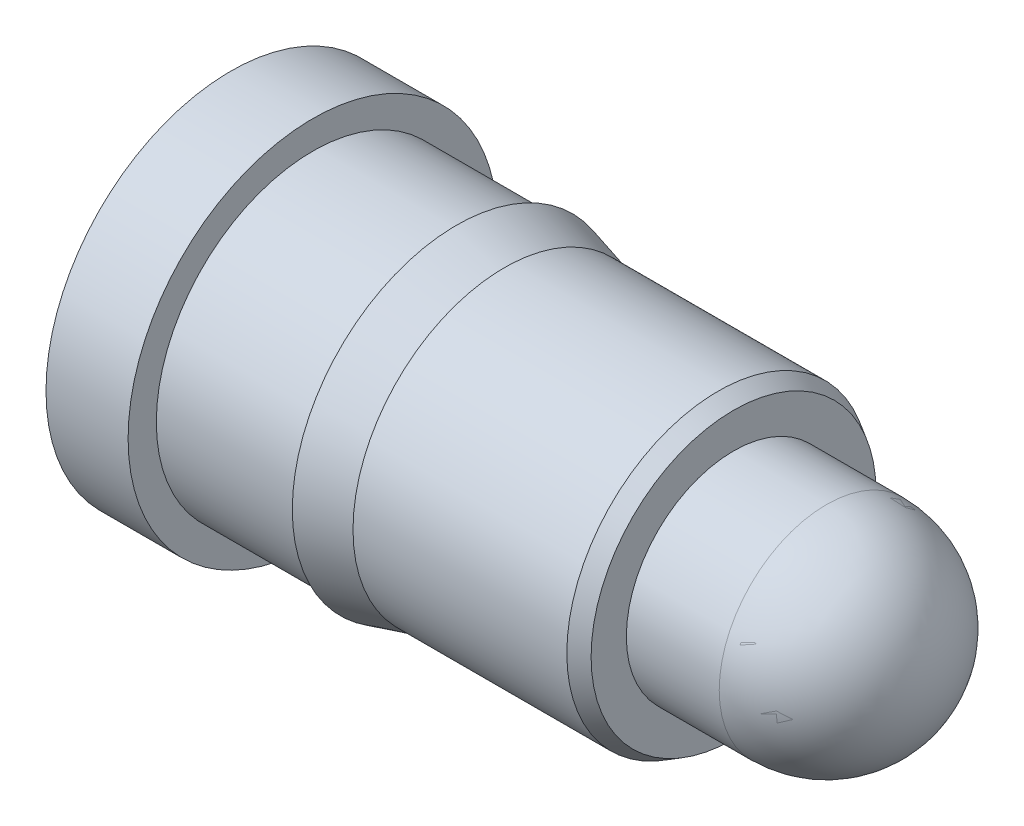
ISO-10303-21;
HEADER;
FILE_DESCRIPTION(('STEP AP214'),'2;1');
FILE_NAME('part.step','',(''),(''),'','','');
FILE_SCHEMA(('AUTOMOTIVE_DESIGN { 1 0 10303 214 1 1 1 1 }'));
ENDSEC;
DATA;
#1=APPLICATION_CONTEXT('core data for automotive mechanical design processes');
#2=APPLICATION_PROTOCOL_DEFINITION('international standard','automotive_design',2000,#1);
#3=PRODUCT_CONTEXT('',#1,'mechanical');
#4=PRODUCT('Part','Part','',(#3));
#5=PRODUCT_RELATED_PRODUCT_CATEGORY('part','',(#4));
#6=PRODUCT_DEFINITION_FORMATION('','',#4);
#7=PRODUCT_DEFINITION_CONTEXT('part definition',#1,'design');
#8=PRODUCT_DEFINITION('design','',#6,#7);
#9=PRODUCT_DEFINITION_SHAPE('','',#8);
#10=(LENGTH_UNIT() NAMED_UNIT(*) SI_UNIT(.MILLI.,.METRE.));
#11=(NAMED_UNIT(*) PLANE_ANGLE_UNIT() SI_UNIT($,.RADIAN.));
#12=(NAMED_UNIT(*) SI_UNIT($,.STERADIAN.) SOLID_ANGLE_UNIT());
#13=UNCERTAINTY_MEASURE_WITH_UNIT(LENGTH_MEASURE(1.E-05),#10,'distance_accuracy_value','');
#14=(GEOMETRIC_REPRESENTATION_CONTEXT(3) GLOBAL_UNCERTAINTY_ASSIGNED_CONTEXT((#13)) GLOBAL_UNIT_ASSIGNED_CONTEXT((#10,
#11,#12)) REPRESENTATION_CONTEXT('',''));
#15=CARTESIAN_POINT('',(0.,0.,0.));
#16=DIRECTION('',(0.,0.,1.));
#17=DIRECTION('',(1.,0.,0.));
#18=AXIS2_PLACEMENT_3D('',#15,#16,#17);
#19=CARTESIAN_POINT('',(2.4892,0.,0.));
#20=DIRECTION('',(-1.,0.,0.));
#21=DIRECTION('',(0.,0.,1.));
#22=AXIS2_PLACEMENT_3D('',#19,#20,#21);
#23=CYLINDRICAL_SURFACE('',#22,0.7493);
#24=CARTESIAN_POINT('',(2.413,0.,0.));
#25=DIRECTION('',(1.,0.,0.));
#26=DIRECTION('',(0.,0.,-1.));
#27=AXIS2_PLACEMENT_3D('',#24,#25,#26);
#28=CIRCLE('',#27,0.7493);
#29=CARTESIAN_POINT('',(2.413,0.,-0.7493));
#30=VERTEX_POINT('',#29);
#31=EDGE_CURVE('P0_E50',#30,#30,#28,.F.);
#32=ORIENTED_EDGE('',*,*,#31,.T.);
#33=EDGE_LOOP('',(#32));
#34=FACE_BOUND('',#33,.T.);
#35=CARTESIAN_POINT('',(1.35458522628063,0.,0.));
#36=DIRECTION('',(-1.,0.,0.));
#37=DIRECTION('',(0.,0.,1.));
#38=AXIS2_PLACEMENT_3D('',#35,#36,#37);
#39=CIRCLE('',#38,0.7493);
#40=CARTESIAN_POINT('',(1.35458522628063,0.,0.7493));
#41=VERTEX_POINT('',#40);
#42=EDGE_CURVE('P0_E75',#41,#41,#39,.T.);
#43=ORIENTED_EDGE('',*,*,#42,.F.);
#44=EDGE_LOOP('',(#43));
#45=FACE_BOUND('',#44,.T.);
#46=ADVANCED_FACE('P0_F42',(#34,#45),#23,.T.);
#47=CARTESIAN_POINT('',(2.4892,0.7493,0.));
#48=DIRECTION('',(1.,0.,0.));
#49=DIRECTION('',(0.,0.,-1.));
#50=AXIS2_PLACEMENT_3D('',#47,#48,#49);
#51=PLANE('',#50);
#52=CARTESIAN_POINT('',(2.4892,0.,0.));
#53=DIRECTION('',(1.,0.,0.));
#54=DIRECTION('',(0.,0.,-1.));
#55=AXIS2_PLACEMENT_3D('',#52,#53,#54);
#56=CIRCLE('',#55,0.705305909487751);
#57=CARTESIAN_POINT('',(2.4892,0.,-0.705305909487751));
#58=VERTEX_POINT('',#57);
#59=EDGE_CURVE('P0_E10',#58,#58,#56,.T.);
#60=ORIENTED_EDGE('',*,*,#59,.T.);
#61=EDGE_LOOP('',(#60));
#62=FACE_BOUND('',#61,.T.);
#63=CARTESIAN_POINT('',(2.4892,0.,0.));
#64=DIRECTION('',(1.,0.,0.));
#65=DIRECTION('',(0.,0.,-1.));
#66=AXIS2_PLACEMENT_3D('',#63,#64,#65);
#67=CIRCLE('',#66,0.53086);
#68=CARTESIAN_POINT('',(2.4892,0.,-0.53086));
#69=VERTEX_POINT('',#68);
#70=EDGE_CURVE('P0_E54',#69,#69,#67,.T.);
#71=ORIENTED_EDGE('',*,*,#70,.F.);
#72=EDGE_LOOP('',(#71));
#73=FACE_BOUND('',#72,.T.);
#74=ADVANCED_FACE('P0_F101',(#62,#73),#51,.T.);
#75=CARTESIAN_POINT('',(0.,0.,0.));
#76=DIRECTION('',(-1.,0.,0.));
#77=DIRECTION('',(0.,0.,1.));
#78=AXIS2_PLACEMENT_3D('',#75,#76,#77);
#79=PLANE('',#78);
#80=CARTESIAN_POINT('',(0.,0.,0.));
#81=DIRECTION('',(-1.,0.,0.));
#82=DIRECTION('',(0.,0.,1.));
#83=AXIS2_PLACEMENT_3D('',#80,#81,#82);
#84=CIRCLE('',#83,0.914399999999999);
#85=CARTESIAN_POINT('',(0.,0.,0.914399999999999));
#86=VERTEX_POINT('',#85);
#87=EDGE_CURVE('P0_E58',#86,#86,#84,.T.);
#88=ORIENTED_EDGE('',*,*,#87,.T.);
#89=EDGE_LOOP('',(#88));
#90=FACE_BOUND('',#89,.T.);
#91=ADVANCED_FACE('P0_F105',(#90),#79,.T.);
#92=CARTESIAN_POINT('',(2.4892,0.,0.));
#93=DIRECTION('',(-1.,0.,0.));
#94=DIRECTION('',(0.,0.,1.));
#95=AXIS2_PLACEMENT_3D('',#92,#93,#94);
#96=CYLINDRICAL_SURFACE('',#95,0.9144);
#97=CARTESIAN_POINT('',(0.4064,0.,0.));
#98=DIRECTION('',(-1.,0.,0.));
#99=DIRECTION('',(0.,0.,1.));
#100=AXIS2_PLACEMENT_3D('',#97,#98,#99);
#101=CIRCLE('',#100,0.9144);
#102=CARTESIAN_POINT('',(0.4064,0.,0.9144));
#103=VERTEX_POINT('',#102);
#104=EDGE_CURVE('P0_E63',#103,#103,#101,.T.);
#105=ORIENTED_EDGE('',*,*,#104,.T.);
#106=EDGE_LOOP('',(#105));
#107=FACE_BOUND('',#106,.T.);
#108=ORIENTED_EDGE('',*,*,#87,.F.);
#109=EDGE_LOOP('',(#108));
#110=FACE_BOUND('',#109,.T.);
#111=ADVANCED_FACE('P0_F111',(#107,#110),#96,.T.);
#112=CARTESIAN_POINT('',(0.4064,0.9144,0.));
#113=DIRECTION('',(1.,0.,0.));
#114=DIRECTION('',(0.,0.,-1.));
#115=AXIS2_PLACEMENT_3D('',#112,#113,#114);
#116=PLANE('',#115);
#117=CARTESIAN_POINT('',(0.4064,0.,0.));
#118=DIRECTION('',(-1.,0.,0.));
#119=DIRECTION('',(0.,0.,1.));
#120=AXIS2_PLACEMENT_3D('',#117,#118,#119);
#121=CIRCLE('',#120,0.7747);
#122=CARTESIAN_POINT('',(0.4064,0.,0.7747));
#123=VERTEX_POINT('',#122);
#124=EDGE_CURVE('P0_E66',#123,#123,#121,.T.);
#125=ORIENTED_EDGE('',*,*,#124,.T.);
#126=EDGE_LOOP('',(#125));
#127=FACE_BOUND('',#126,.T.);
#128=ORIENTED_EDGE('',*,*,#104,.F.);
#129=EDGE_LOOP('',(#128));
#130=FACE_BOUND('',#129,.T.);
#131=ADVANCED_FACE('P0_F115',(#127,#130),#116,.T.);
#132=CARTESIAN_POINT('',(2.4892,0.,0.));
#133=DIRECTION('',(-1.,0.,0.));
#134=DIRECTION('',(0.,0.,1.));
#135=AXIS2_PLACEMENT_3D('',#132,#133,#134);
#136=CYLINDRICAL_SURFACE('',#135,0.7747);
#137=CARTESIAN_POINT('',(1.1176,0.,0.));
#138=DIRECTION('',(-1.,0.,0.));
#139=DIRECTION('',(0.,0.,1.));
#140=AXIS2_PLACEMENT_3D('',#137,#138,#139);
#141=CIRCLE('',#140,0.7747);
#142=CARTESIAN_POINT('',(1.1176,0.,0.7747));
#143=VERTEX_POINT('',#142);
#144=EDGE_CURVE('P0_E69',#143,#143,#141,.T.);
#145=ORIENTED_EDGE('',*,*,#144,.T.);
#146=EDGE_LOOP('',(#145));
#147=FACE_BOUND('',#146,.T.);
#148=ORIENTED_EDGE('',*,*,#124,.F.);
#149=EDGE_LOOP('',(#148));
#150=FACE_BOUND('',#149,.T.);
#151=ADVANCED_FACE('P0_F119',(#147,#150),#136,.T.);
#152=CARTESIAN_POINT('',(1.1176,0.7747,0.));
#153=DIRECTION('',(-1.,0.,0.));
#154=DIRECTION('',(0.,0.,1.));
#155=AXIS2_PLACEMENT_3D('',#152,#153,#154);
#156=PLANE('',#155);
#157=CARTESIAN_POINT('',(1.1176,0.,0.));
#158=DIRECTION('',(-1.,0.,0.));
#159=DIRECTION('',(0.,0.,1.));
#160=AXIS2_PLACEMENT_3D('',#157,#158,#159);
#161=CIRCLE('',#160,0.8128);
#162=CARTESIAN_POINT('',(1.1176,0.,0.8128));
#163=VERTEX_POINT('',#162);
#164=EDGE_CURVE('P0_E72',#163,#163,#161,.T.);
#165=ORIENTED_EDGE('',*,*,#164,.T.);
#166=EDGE_LOOP('',(#165));
#167=FACE_BOUND('',#166,.T.);
#168=ORIENTED_EDGE('',*,*,#144,.F.);
#169=EDGE_LOOP('',(#168));
#170=FACE_BOUND('',#169,.T.);
#171=ADVANCED_FACE('P0_F97',(#167,#170),#156,.T.);
#172=CARTESIAN_POINT('',(1.1176,0.,0.));
#173=DIRECTION('',(-1.,0.,0.));
#174=DIRECTION('',(0.,0.,1.));
#175=AXIS2_PLACEMENT_3D('',#172,#173,#174);
#176=CONICAL_SURFACE('',#175,0.8128,0.26179938779915);
#177=ORIENTED_EDGE('',*,*,#42,.T.);
#178=EDGE_LOOP('',(#177));
#179=FACE_BOUND('',#178,.T.);
#180=ORIENTED_EDGE('',*,*,#164,.F.);
#181=EDGE_LOOP('',(#180));
#182=FACE_BOUND('',#181,.T.);
#183=ADVANCED_FACE('P0_F90',(#179,#182),#176,.T.);
#184=CARTESIAN_POINT('',(2.94894,0.,0.));
#185=DIRECTION('',(-1.,0.,0.));
#186=DIRECTION('',(0.,1.,0.));
#187=AXIS2_PLACEMENT_3D('',#184,#185,#186);
#188=SPHERICAL_SURFACE('',#187,0.53086);
#189=CARTESIAN_POINT('',(2.94894,0.,0.));
#190=DIRECTION('',(-1.,0.,0.));
#191=DIRECTION('',(0.,0.,1.));
#192=AXIS2_PLACEMENT_3D('',#189,#190,#191);
#193=CIRCLE('',#192,0.53086);
#194=CARTESIAN_POINT('',(2.94894,0.,0.53086));
#195=VERTEX_POINT('',#194);
#196=EDGE_CURVE('P0_E78',#195,#195,#193,.T.);
#197=ORIENTED_EDGE('',*,*,#196,.F.);
#198=EDGE_LOOP('',(#197));
#199=FACE_BOUND('',#198,.T.);
#200=ADVANCED_FACE('P0_F88',(#199),#188,.T.);
#201=CARTESIAN_POINT('',(5.0891502532164,0.,0.));
#202=DIRECTION('',(-1.,0.,0.));
#203=DIRECTION('',(0.,0.,1.));
#204=AXIS2_PLACEMENT_3D('',#201,#202,#203);
#205=CYLINDRICAL_SURFACE('',#204,0.53086);
#206=ORIENTED_EDGE('',*,*,#196,.T.);
#207=EDGE_LOOP('',(#206));
#208=FACE_BOUND('',#207,.T.);
#209=ORIENTED_EDGE('',*,*,#70,.T.);
#210=EDGE_LOOP('',(#209));
#211=FACE_BOUND('',#210,.T.);
#212=ADVANCED_FACE('P0_F85',(#208,#211),#205,.T.);
#213=CARTESIAN_POINT('',(2.413,0.,0.));
#214=DIRECTION('',(-1.,0.,0.));
#215=DIRECTION('',(0.,0.,1.));
#216=AXIS2_PLACEMENT_3D('',#213,#214,#215);
#217=CONICAL_SURFACE('',#216,0.7493,0.523598775598292);
#218=ORIENTED_EDGE('',*,*,#59,.F.);
#219=EDGE_LOOP('',(#218));
#220=FACE_BOUND('',#219,.T.);
#221=ORIENTED_EDGE('',*,*,#31,.F.);
#222=EDGE_LOOP('',(#221));
#223=FACE_BOUND('',#222,.T.);
#224=ADVANCED_FACE('P0_F45',(#220,#223),#217,.T.);
#225=CLOSED_SHELL('',(#46,#74,#91,#111,#131,#151,#171,#183,#200,#212,#224));
#226=MANIFOLD_SOLID_BREP('P0_B2',#225);
#227=CARTESIAN_POINT('',(2.94894,0.,0.));
#228=DIRECTION('',(-1.,0.,0.));
#229=DIRECTION('',(0.,1.,0.));
#230=AXIS2_PLACEMENT_3D('',#227,#228,#229);
#231=SPHERICAL_SURFACE('',#230,0.53086);
#232=CARTESIAN_POINT('',(2.94894,0.,0.));
#233=DIRECTION('',(-1.,0.,0.));
#234=DIRECTION('',(0.,0.,1.));
#235=AXIS2_PLACEMENT_3D('',#232,#233,#234);
#236=CIRCLE('',#235,0.53086);
#237=CARTESIAN_POINT('',(2.94894,0.,0.53086));
#238=VERTEX_POINT('',#237);
#239=EDGE_CURVE('P1_E10',#238,#238,#236,.T.);
#240=ORIENTED_EDGE('',*,*,#239,.F.);
#241=EDGE_LOOP('',(#240));
#242=FACE_BOUND('',#241,.T.);
#243=ADVANCED_FACE('P1_F14',(#242),#231,.T.);
#244=OPEN_SHELL('',(#243));
#245=SHELL_BASED_SURFACE_MODEL('P1_B1',(#244));
#246=ADVANCED_BREP_SHAPE_REPRESENTATION('',(#18,#226),#14);
#247=MANIFOLD_SURFACE_SHAPE_REPRESENTATION('',(#18,#245),#14);
#248=SHAPE_REPRESENTATION('',(#18),#14);
#249=SHAPE_DEFINITION_REPRESENTATION(#9,#248);
#250=SHAPE_REPRESENTATION_RELATIONSHIP('','',#248,#246);
#251=SHAPE_REPRESENTATION_RELATIONSHIP('','',#248,#247);
ENDSEC;
END-ISO-10303-21;
